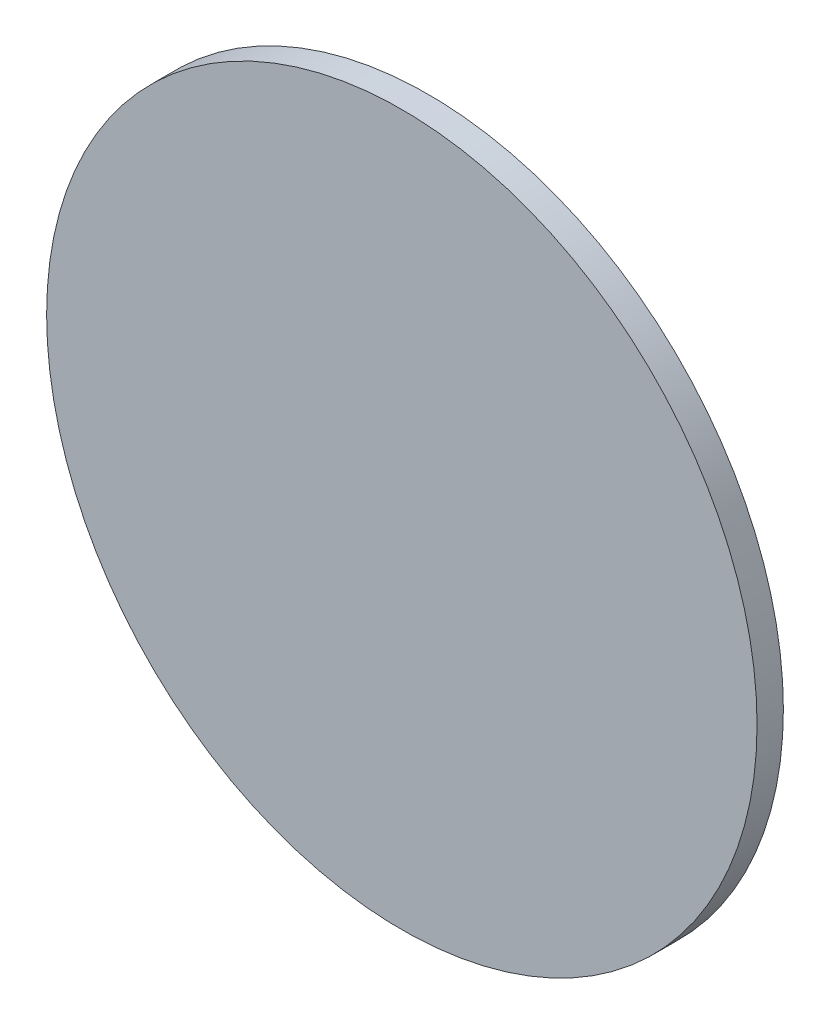
ISO-10303-21;
HEADER;
FILE_DESCRIPTION(('STEP AP214'),'2;1');
FILE_NAME('part.step','',(''),(''),'','','');
FILE_SCHEMA(('AUTOMOTIVE_DESIGN { 1 0 10303 214 1 1 1 1 }'));
ENDSEC;
DATA;
#1=APPLICATION_CONTEXT('core data for automotive mechanical design processes');
#2=APPLICATION_PROTOCOL_DEFINITION('international standard','automotive_design',2000,#1);
#3=PRODUCT_CONTEXT('',#1,'mechanical');
#4=PRODUCT('Part','Part','',(#3));
#5=PRODUCT_RELATED_PRODUCT_CATEGORY('part','',(#4));
#6=PRODUCT_DEFINITION_FORMATION('','',#4);
#7=PRODUCT_DEFINITION_CONTEXT('part definition',#1,'design');
#8=PRODUCT_DEFINITION('design','',#6,#7);
#9=PRODUCT_DEFINITION_SHAPE('','',#8);
#10=(LENGTH_UNIT() NAMED_UNIT(*) SI_UNIT(.MILLI.,.METRE.));
#11=(NAMED_UNIT(*) PLANE_ANGLE_UNIT() SI_UNIT($,.RADIAN.));
#12=(NAMED_UNIT(*) SI_UNIT($,.STERADIAN.) SOLID_ANGLE_UNIT());
#13=UNCERTAINTY_MEASURE_WITH_UNIT(LENGTH_MEASURE(1.E-05),#10,'distance_accuracy_value','');
#14=(GEOMETRIC_REPRESENTATION_CONTEXT(3) GLOBAL_UNCERTAINTY_ASSIGNED_CONTEXT((#13)) GLOBAL_UNIT_ASSIGNED_CONTEXT((#10,
#11,#12)) REPRESENTATION_CONTEXT('',''));
#15=CARTESIAN_POINT('',(0.,0.,0.));
#16=DIRECTION('',(0.,0.,1.));
#17=DIRECTION('',(1.,0.,0.));
#18=AXIS2_PLACEMENT_3D('',#15,#16,#17);
#19=CARTESIAN_POINT('',(0.,0.,2.));
#20=DIRECTION('',(0.,0.,-1.));
#21=DIRECTION('',(-1.,0.,0.));
#22=AXIS2_PLACEMENT_3D('',#19,#20,#21);
#23=CYLINDRICAL_SURFACE('',#22,27.);
#24=CARTESIAN_POINT('',(0.,0.,2.));
#25=DIRECTION('',(0.,0.,1.));
#26=DIRECTION('',(1.,0.,0.));
#27=AXIS2_PLACEMENT_3D('',#24,#25,#26);
#28=CIRCLE('',#27,27.);
#29=CARTESIAN_POINT('',(27.,0.,2.));
#30=VERTEX_POINT('',#29);
#31=EDGE_CURVE('E10',#30,#30,#28,.T.);
#32=ORIENTED_EDGE('',*,*,#31,.F.);
#33=EDGE_LOOP('',(#32));
#34=FACE_BOUND('',#33,.T.);
#35=CARTESIAN_POINT('',(0.,0.,0.));
#36=DIRECTION('',(0.,0.,1.));
#37=DIRECTION('',(1.,0.,0.));
#38=AXIS2_PLACEMENT_3D('',#35,#36,#37);
#39=CIRCLE('',#38,27.);
#40=CARTESIAN_POINT('',(27.,0.,0.));
#41=VERTEX_POINT('',#40);
#42=EDGE_CURVE('E33',#41,#41,#39,.T.);
#43=ORIENTED_EDGE('',*,*,#42,.T.);
#44=EDGE_LOOP('',(#43));
#45=FACE_BOUND('',#44,.T.);
#46=ADVANCED_FACE('F30',(#34,#45),#23,.T.);
#47=CARTESIAN_POINT('',(0.,0.,2.));
#48=DIRECTION('',(0.,0.,1.));
#49=DIRECTION('',(1.,0.,0.));
#50=AXIS2_PLACEMENT_3D('',#47,#48,#49);
#51=PLANE('',#50);
#52=ORIENTED_EDGE('',*,*,#31,.T.);
#53=EDGE_LOOP('',(#52));
#54=FACE_BOUND('',#53,.T.);
#55=ADVANCED_FACE('F45',(#54),#51,.T.);
#56=CARTESIAN_POINT('',(0.,0.,0.));
#57=DIRECTION('',(0.,0.,1.));
#58=DIRECTION('',(1.,0.,0.));
#59=AXIS2_PLACEMENT_3D('',#56,#57,#58);
#60=PLANE('',#59);
#61=ORIENTED_EDGE('',*,*,#42,.F.);
#62=EDGE_LOOP('',(#61));
#63=FACE_BOUND('',#62,.T.);
#64=ADVANCED_FACE('F43',(#63),#60,.F.);
#65=CLOSED_SHELL('',(#46,#55,#64));
#66=MANIFOLD_SOLID_BREP('B2',#65);
#67=ADVANCED_BREP_SHAPE_REPRESENTATION('',(#18,#66),#14);
#68=SHAPE_DEFINITION_REPRESENTATION(#9,#67);
ENDSEC;
END-ISO-10303-21;
